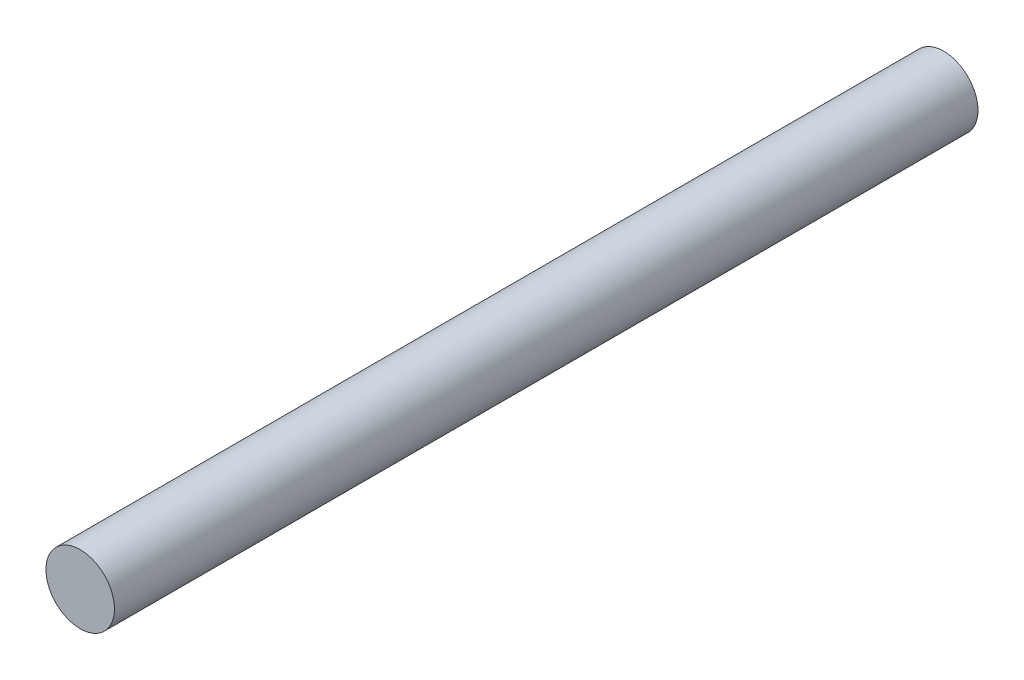
ISO-10303-21;
HEADER;
FILE_DESCRIPTION(('STEP AP214'),'2;1');
FILE_NAME('part.step','',(''),(''),'','','');
FILE_SCHEMA(('AUTOMOTIVE_DESIGN { 1 0 10303 214 1 1 1 1 }'));
ENDSEC;
DATA;
#1=APPLICATION_CONTEXT('core data for automotive mechanical design processes');
#2=APPLICATION_PROTOCOL_DEFINITION('international standard','automotive_design',2000,#1);
#3=PRODUCT_CONTEXT('',#1,'mechanical');
#4=PRODUCT('Part','Part','',(#3));
#5=PRODUCT_RELATED_PRODUCT_CATEGORY('part','',(#4));
#6=PRODUCT_DEFINITION_FORMATION('','',#4);
#7=PRODUCT_DEFINITION_CONTEXT('part definition',#1,'design');
#8=PRODUCT_DEFINITION('design','',#6,#7);
#9=PRODUCT_DEFINITION_SHAPE('','',#8);
#10=(LENGTH_UNIT() NAMED_UNIT(*) SI_UNIT(.MILLI.,.METRE.));
#11=(NAMED_UNIT(*) PLANE_ANGLE_UNIT() SI_UNIT($,.RADIAN.));
#12=(NAMED_UNIT(*) SI_UNIT($,.STERADIAN.) SOLID_ANGLE_UNIT());
#13=UNCERTAINTY_MEASURE_WITH_UNIT(LENGTH_MEASURE(1.E-05),#10,'distance_accuracy_value','');
#14=(GEOMETRIC_REPRESENTATION_CONTEXT(3) GLOBAL_UNCERTAINTY_ASSIGNED_CONTEXT((#13)) GLOBAL_UNIT_ASSIGNED_CONTEXT((#10,
#11,#12)) REPRESENTATION_CONTEXT('',''));
#15=CARTESIAN_POINT('',(0.,0.,0.));
#16=DIRECTION('',(0.,0.,1.));
#17=DIRECTION('',(1.,0.,0.));
#18=AXIS2_PLACEMENT_3D('',#15,#16,#17);
#19=CARTESIAN_POINT('',(0.,0.,160.));
#20=DIRECTION('',(0.,0.,-1.));
#21=DIRECTION('',(-1.,0.,0.));
#22=AXIS2_PLACEMENT_3D('',#19,#20,#21);
#23=CYLINDRICAL_SURFACE('',#22,6.35);
#24=CARTESIAN_POINT('',(0.,0.,160.));
#25=DIRECTION('',(0.,0.,1.));
#26=DIRECTION('',(1.,0.,0.));
#27=AXIS2_PLACEMENT_3D('',#24,#25,#26);
#28=CIRCLE('',#27,6.35);
#29=CARTESIAN_POINT('',(6.35,0.,160.));
#30=VERTEX_POINT('',#29);
#31=EDGE_CURVE('E10',#30,#30,#28,.T.);
#32=ORIENTED_EDGE('',*,*,#31,.F.);
#33=EDGE_LOOP('',(#32));
#34=FACE_BOUND('',#33,.T.);
#35=CARTESIAN_POINT('',(0.,0.,0.));
#36=DIRECTION('',(0.,0.,1.));
#37=DIRECTION('',(1.,0.,0.));
#38=AXIS2_PLACEMENT_3D('',#35,#36,#37);
#39=CIRCLE('',#38,6.35);
#40=CARTESIAN_POINT('',(6.35,0.,0.));
#41=VERTEX_POINT('',#40);
#42=EDGE_CURVE('E48',#41,#41,#39,.T.);
#43=ORIENTED_EDGE('',*,*,#42,.T.);
#44=EDGE_LOOP('',(#43));
#45=FACE_BOUND('',#44,.T.);
#46=ADVANCED_FACE('F45',(#34,#45),#23,.T.);
#47=CARTESIAN_POINT('',(0.,0.,160.));
#48=DIRECTION('',(0.,0.,1.));
#49=DIRECTION('',(1.,0.,0.));
#50=AXIS2_PLACEMENT_3D('',#47,#48,#49);
#51=PLANE('',#50);
#52=ORIENTED_EDGE('',*,*,#31,.T.);
#53=EDGE_LOOP('',(#52));
#54=FACE_BOUND('',#53,.T.);
#55=ADVANCED_FACE('F62',(#54),#51,.T.);
#56=CARTESIAN_POINT('',(0.,0.,0.));
#57=DIRECTION('',(0.,0.,1.));
#58=DIRECTION('',(1.,0.,0.));
#59=AXIS2_PLACEMENT_3D('',#56,#57,#58);
#60=PLANE('',#59);
#61=ORIENTED_EDGE('',*,*,#42,.F.);
#62=EDGE_LOOP('',(#61));
#63=FACE_BOUND('',#62,.T.);
#64=ADVANCED_FACE('F60',(#63),#60,.F.);
#65=CLOSED_SHELL('',(#46,#55,#64));
#66=MANIFOLD_SOLID_BREP('B2',#65);
#67=ADVANCED_BREP_SHAPE_REPRESENTATION('',(#18,#66),#14);
#68=SHAPE_DEFINITION_REPRESENTATION(#9,#67);
ENDSEC;
END-ISO-10303-21;
